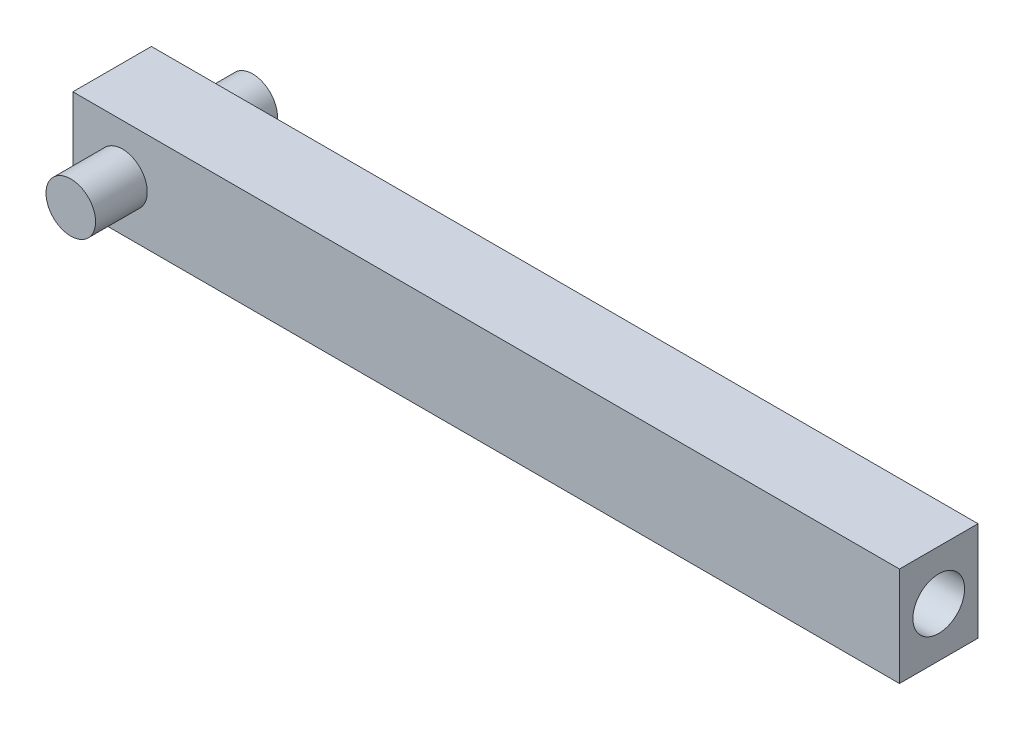
ISO-10303-21;
HEADER;
FILE_DESCRIPTION(('STEP AP214'),'2;1');
FILE_NAME('part.step','',(''),(''),'','','');
FILE_SCHEMA(('AUTOMOTIVE_DESIGN { 1 0 10303 214 1 1 1 1 }'));
ENDSEC;
DATA;
#1=APPLICATION_CONTEXT('core data for automotive mechanical design processes');
#2=APPLICATION_PROTOCOL_DEFINITION('international standard','automotive_design',2000,#1);
#3=PRODUCT_CONTEXT('',#1,'mechanical');
#4=PRODUCT('Part','Part','',(#3));
#5=PRODUCT_RELATED_PRODUCT_CATEGORY('part','',(#4));
#6=PRODUCT_DEFINITION_FORMATION('','',#4);
#7=PRODUCT_DEFINITION_CONTEXT('part definition',#1,'design');
#8=PRODUCT_DEFINITION('design','',#6,#7);
#9=PRODUCT_DEFINITION_SHAPE('','',#8);
#10=(LENGTH_UNIT() NAMED_UNIT(*) SI_UNIT(.MILLI.,.METRE.));
#11=(NAMED_UNIT(*) PLANE_ANGLE_UNIT() SI_UNIT($,.RADIAN.));
#12=(NAMED_UNIT(*) SI_UNIT($,.STERADIAN.) SOLID_ANGLE_UNIT());
#13=UNCERTAINTY_MEASURE_WITH_UNIT(LENGTH_MEASURE(1.E-05),#10,'distance_accuracy_value','');
#14=(GEOMETRIC_REPRESENTATION_CONTEXT(3) GLOBAL_UNCERTAINTY_ASSIGNED_CONTEXT((#13)) GLOBAL_UNIT_ASSIGNED_CONTEXT((#10,
#11,#12)) REPRESENTATION_CONTEXT('',''));
#15=CARTESIAN_POINT('',(0.,0.,0.));
#16=DIRECTION('',(0.,0.,1.));
#17=DIRECTION('',(1.,0.,0.));
#18=AXIS2_PLACEMENT_3D('',#15,#16,#17);
#19=CARTESIAN_POINT('',(200.,48.,-19.));
#20=DIRECTION('',(-1.,0.,0.));
#21=DIRECTION('',(0.,0.,1.));
#22=AXIS2_PLACEMENT_3D('',#19,#20,#21);
#23=PLANE('',#22);
#24=CARTESIAN_POINT('',(200.,24.,0.));
#25=DIRECTION('',(1.,0.,0.));
#26=DIRECTION('',(0.,0.,-1.));
#27=AXIS2_PLACEMENT_3D('',#24,#25,#26);
#28=CIRCLE('',#27,12.5);
#29=CARTESIAN_POINT('',(200.,24.,-12.5));
#30=VERTEX_POINT('',#29);
#31=EDGE_CURVE('E148',#30,#30,#28,.T.);
#32=ORIENTED_EDGE('',*,*,#31,.F.);
#33=EDGE_LOOP('',(#32));
#34=FACE_BOUND('',#33,.T.);
#35=DIRECTION('',(0.,0.,-1.));
#36=VECTOR('',#35,1.);
#37=CARTESIAN_POINT('',(200.,0.,-19.));
#38=LINE('',#37,#36);
#39=CARTESIAN_POINT('',(200.,0.,19.));
#40=VERTEX_POINT('',#39);
#41=CARTESIAN_POINT('',(200.,0.,-19.));
#42=VERTEX_POINT('',#41);
#43=EDGE_CURVE('E114',#40,#42,#38,.T.);
#44=ORIENTED_EDGE('',*,*,#43,.T.);
#45=DIRECTION('',(0.,-1.,0.));
#46=VECTOR('',#45,1.);
#47=CARTESIAN_POINT('',(200.,48.,-19.));
#48=LINE('',#47,#46);
#49=CARTESIAN_POINT('',(200.,48.,-19.));
#50=VERTEX_POINT('',#49);
#51=EDGE_CURVE('E105',#50,#42,#48,.T.);
#52=ORIENTED_EDGE('',*,*,#51,.F.);
#53=DIRECTION('',(0.,0.,-1.));
#54=VECTOR('',#53,1.);
#55=CARTESIAN_POINT('',(200.,48.,-19.));
#56=LINE('',#55,#54);
#57=CARTESIAN_POINT('',(200.,48.,19.));
#58=VERTEX_POINT('',#57);
#59=EDGE_CURVE('E99',#58,#50,#56,.T.);
#60=ORIENTED_EDGE('',*,*,#59,.F.);
#61=DIRECTION('',(0.,-1.,0.));
#62=VECTOR('',#61,1.);
#63=CARTESIAN_POINT('',(200.,48.,19.));
#64=LINE('',#63,#62);
#65=EDGE_CURVE('E110',#58,#40,#64,.T.);
#66=ORIENTED_EDGE('',*,*,#65,.T.);
#67=EDGE_LOOP('',(#44,#52,#60,#66));
#68=FACE_BOUND('',#67,.T.);
#69=ADVANCED_FACE('F47',(#34,#68),#23,.F.);
#70=CARTESIAN_POINT('',(-200.,48.,-19.));
#71=DIRECTION('',(0.,0.,1.));
#72=DIRECTION('',(1.,0.,0.));
#73=AXIS2_PLACEMENT_3D('',#70,#71,#72);
#74=PLANE('',#73);
#75=CARTESIAN_POINT('',(-176.,24.,-19.));
#76=DIRECTION('',(0.,0.,1.));
#77=DIRECTION('',(1.,0.,0.));
#78=AXIS2_PLACEMENT_3D('',#75,#76,#77);
#79=CIRCLE('',#78,12.);
#80=CARTESIAN_POINT('',(-164.,24.,-19.));
#81=VERTEX_POINT('',#80);
#82=EDGE_CURVE('E11',#81,#81,#79,.F.);
#83=ORIENTED_EDGE('',*,*,#82,.F.);
#84=EDGE_LOOP('',(#83));
#85=FACE_BOUND('',#84,.T.);
#86=DIRECTION('',(-1.,0.,0.));
#87=VECTOR('',#86,1.);
#88=CARTESIAN_POINT('',(-200.,0.,-19.));
#89=LINE('',#88,#87);
#90=CARTESIAN_POINT('',(-200.,0.,-19.));
#91=VERTEX_POINT('',#90);
#92=EDGE_CURVE('E104',#42,#91,#89,.T.);
#93=ORIENTED_EDGE('',*,*,#92,.T.);
#94=DIRECTION('',(0.,-1.,0.));
#95=VECTOR('',#94,1.);
#96=CARTESIAN_POINT('',(-200.,48.,-19.));
#97=LINE('',#96,#95);
#98=CARTESIAN_POINT('',(-200.,48.,-19.));
#99=VERTEX_POINT('',#98);
#100=EDGE_CURVE('E102',#99,#91,#97,.T.);
#101=ORIENTED_EDGE('',*,*,#100,.F.);
#102=DIRECTION('',(-1.,0.,0.));
#103=VECTOR('',#102,1.);
#104=CARTESIAN_POINT('',(-200.,48.,-19.));
#105=LINE('',#104,#103);
#106=EDGE_CURVE('E94',#50,#99,#105,.T.);
#107=ORIENTED_EDGE('',*,*,#106,.F.);
#108=ORIENTED_EDGE('',*,*,#51,.T.);
#109=EDGE_LOOP('',(#93,#101,#107,#108));
#110=FACE_BOUND('',#109,.T.);
#111=ADVANCED_FACE('F103',(#85,#110),#74,.F.);
#112=CARTESIAN_POINT('',(-200.,48.,-19.));
#113=DIRECTION('',(1.,0.,0.));
#114=DIRECTION('',(0.,0.,-1.));
#115=AXIS2_PLACEMENT_3D('',#112,#113,#114);
#116=PLANE('',#115);
#117=DIRECTION('',(0.,0.,1.));
#118=VECTOR('',#117,1.);
#119=CARTESIAN_POINT('',(-200.,0.,-19.));
#120=LINE('',#119,#118);
#121=CARTESIAN_POINT('',(-200.,0.,19.));
#122=VERTEX_POINT('',#121);
#123=EDGE_CURVE('E80',#91,#122,#120,.T.);
#124=ORIENTED_EDGE('',*,*,#123,.T.);
#125=DIRECTION('',(0.,-1.,0.));
#126=VECTOR('',#125,1.);
#127=CARTESIAN_POINT('',(-200.,48.,19.));
#128=LINE('',#127,#126);
#129=CARTESIAN_POINT('',(-200.,48.,19.));
#130=VERTEX_POINT('',#129);
#131=EDGE_CURVE('E106',#130,#122,#128,.T.);
#132=ORIENTED_EDGE('',*,*,#131,.F.);
#133=DIRECTION('',(0.,0.,1.));
#134=VECTOR('',#133,1.);
#135=CARTESIAN_POINT('',(-200.,48.,-19.));
#136=LINE('',#135,#134);
#137=EDGE_CURVE('E97',#99,#130,#136,.T.);
#138=ORIENTED_EDGE('',*,*,#137,.F.);
#139=ORIENTED_EDGE('',*,*,#100,.T.);
#140=EDGE_LOOP('',(#124,#132,#138,#139));
#141=FACE_BOUND('',#140,.T.);
#142=ADVANCED_FACE('F108',(#141),#116,.F.);
#143=CARTESIAN_POINT('',(-200.,48.,19.));
#144=DIRECTION('',(0.,0.,-1.));
#145=DIRECTION('',(-1.,0.,0.));
#146=AXIS2_PLACEMENT_3D('',#143,#144,#145);
#147=PLANE('',#146);
#148=CARTESIAN_POINT('',(-176.,24.,19.));
#149=DIRECTION('',(0.,0.,-1.));
#150=DIRECTION('',(-1.,0.,0.));
#151=AXIS2_PLACEMENT_3D('',#148,#149,#150);
#152=CIRCLE('',#151,12.);
#153=CARTESIAN_POINT('',(-188.,24.,19.));
#154=VERTEX_POINT('',#153);
#155=EDGE_CURVE('E55',#154,#154,#152,.F.);
#156=ORIENTED_EDGE('',*,*,#155,.F.);
#157=EDGE_LOOP('',(#156));
#158=FACE_BOUND('',#157,.T.);
#159=DIRECTION('',(1.,0.,0.));
#160=VECTOR('',#159,1.);
#161=CARTESIAN_POINT('',(-200.,0.,19.));
#162=LINE('',#161,#160);
#163=EDGE_CURVE('E86',#122,#40,#162,.T.);
#164=ORIENTED_EDGE('',*,*,#163,.T.);
#165=ORIENTED_EDGE('',*,*,#65,.F.);
#166=DIRECTION('',(1.,0.,0.));
#167=VECTOR('',#166,1.);
#168=CARTESIAN_POINT('',(-200.,48.,19.));
#169=LINE('',#168,#167);
#170=EDGE_CURVE('E63',#130,#58,#169,.T.);
#171=ORIENTED_EDGE('',*,*,#170,.F.);
#172=ORIENTED_EDGE('',*,*,#131,.T.);
#173=EDGE_LOOP('',(#164,#165,#171,#172));
#174=FACE_BOUND('',#173,.T.);
#175=ADVANCED_FACE('F128',(#158,#174),#147,.F.);
#176=CARTESIAN_POINT('',(0.,48.,0.));
#177=DIRECTION('',(0.,1.,0.));
#178=DIRECTION('',(0.,0.,1.));
#179=AXIS2_PLACEMENT_3D('',#176,#177,#178);
#180=PLANE('',#179);
#181=ORIENTED_EDGE('',*,*,#59,.T.);
#182=ORIENTED_EDGE('',*,*,#106,.T.);
#183=ORIENTED_EDGE('',*,*,#137,.T.);
#184=ORIENTED_EDGE('',*,*,#170,.T.);
#185=EDGE_LOOP('',(#181,#182,#183,#184));
#186=FACE_BOUND('',#185,.T.);
#187=ADVANCED_FACE('F95',(#186),#180,.T.);
#188=CARTESIAN_POINT('',(0.,0.,0.));
#189=DIRECTION('',(0.,1.,0.));
#190=DIRECTION('',(0.,0.,1.));
#191=AXIS2_PLACEMENT_3D('',#188,#189,#190);
#192=PLANE('',#191);
#193=ORIENTED_EDGE('',*,*,#43,.F.);
#194=ORIENTED_EDGE('',*,*,#163,.F.);
#195=ORIENTED_EDGE('',*,*,#123,.F.);
#196=ORIENTED_EDGE('',*,*,#92,.F.);
#197=EDGE_LOOP('',(#193,#194,#195,#196));
#198=FACE_BOUND('',#197,.T.);
#199=ADVANCED_FACE('F135',(#198),#192,.F.);
#200=CARTESIAN_POINT('',(-176.,24.,44.));
#201=DIRECTION('',(0.,0.,-1.));
#202=DIRECTION('',(-1.,0.,0.));
#203=AXIS2_PLACEMENT_3D('',#200,#201,#202);
#204=CYLINDRICAL_SURFACE('',#203,12.);
#205=CARTESIAN_POINT('',(-176.,24.,44.));
#206=DIRECTION('',(0.,0.,1.));
#207=DIRECTION('',(1.,0.,0.));
#208=AXIS2_PLACEMENT_3D('',#205,#206,#207);
#209=CIRCLE('',#208,12.);
#210=CARTESIAN_POINT('',(-164.,24.,44.));
#211=VERTEX_POINT('',#210);
#212=EDGE_CURVE('E117',#211,#211,#209,.T.);
#213=ORIENTED_EDGE('',*,*,#212,.F.);
#214=EDGE_LOOP('',(#213));
#215=FACE_BOUND('',#214,.T.);
#216=ORIENTED_EDGE('',*,*,#155,.T.);
#217=EDGE_LOOP('',(#216));
#218=FACE_BOUND('',#217,.T.);
#219=ADVANCED_FACE('F126',(#215,#218),#204,.T.);
#220=CARTESIAN_POINT('',(-176.,24.,44.));
#221=DIRECTION('',(0.,0.,1.));
#222=DIRECTION('',(1.,0.,0.));
#223=AXIS2_PLACEMENT_3D('',#220,#221,#222);
#224=PLANE('',#223);
#225=ORIENTED_EDGE('',*,*,#212,.T.);
#226=EDGE_LOOP('',(#225));
#227=FACE_BOUND('',#226,.T.);
#228=ADVANCED_FACE('F155',(#227),#224,.T.);
#229=CARTESIAN_POINT('',(-176.,24.,-44.));
#230=DIRECTION('',(0.,0.,1.));
#231=DIRECTION('',(1.,0.,0.));
#232=AXIS2_PLACEMENT_3D('',#229,#230,#231);
#233=CYLINDRICAL_SURFACE('',#232,12.);
#234=CARTESIAN_POINT('',(-176.,24.,-44.));
#235=DIRECTION('',(0.,0.,-1.));
#236=DIRECTION('',(-1.,0.,0.));
#237=AXIS2_PLACEMENT_3D('',#234,#235,#236);
#238=CIRCLE('',#237,12.);
#239=CARTESIAN_POINT('',(-188.,24.,-44.));
#240=VERTEX_POINT('',#239);
#241=EDGE_CURVE('E182',#240,#240,#238,.T.);
#242=ORIENTED_EDGE('',*,*,#241,.F.);
#243=EDGE_LOOP('',(#242));
#244=FACE_BOUND('',#243,.T.);
#245=ORIENTED_EDGE('',*,*,#82,.T.);
#246=EDGE_LOOP('',(#245));
#247=FACE_BOUND('',#246,.T.);
#248=ADVANCED_FACE('F161',(#244,#247),#233,.T.);
#249=CARTESIAN_POINT('',(-176.,24.,-44.));
#250=DIRECTION('',(0.,0.,-1.));
#251=DIRECTION('',(-1.,0.,0.));
#252=AXIS2_PLACEMENT_3D('',#249,#250,#251);
#253=PLANE('',#252);
#254=ORIENTED_EDGE('',*,*,#241,.T.);
#255=EDGE_LOOP('',(#254));
#256=FACE_BOUND('',#255,.T.);
#257=ADVANCED_FACE('F165',(#256),#253,.T.);
#258=CARTESIAN_POINT('',(150.,24.,0.));
#259=DIRECTION('',(1.,0.,0.));
#260=DIRECTION('',(0.,0.,-1.));
#261=AXIS2_PLACEMENT_3D('',#258,#259,#260);
#262=CYLINDRICAL_SURFACE('',#261,12.5);
#263=CARTESIAN_POINT('',(150.,24.,0.));
#264=DIRECTION('',(1.,0.,0.));
#265=DIRECTION('',(0.,0.,-1.));
#266=AXIS2_PLACEMENT_3D('',#263,#264,#265);
#267=CIRCLE('',#266,12.5);
#268=CARTESIAN_POINT('',(150.,24.,-12.5));
#269=VERTEX_POINT('',#268);
#270=EDGE_CURVE('E181',#269,#269,#267,.T.);
#271=ORIENTED_EDGE('',*,*,#270,.F.);
#272=EDGE_LOOP('',(#271));
#273=FACE_BOUND('',#272,.T.);
#274=ORIENTED_EDGE('',*,*,#31,.T.);
#275=EDGE_LOOP('',(#274));
#276=FACE_BOUND('',#275,.T.);
#277=ADVANCED_FACE('F169',(#273,#276),#262,.F.);
#278=CARTESIAN_POINT('',(150.,24.,0.));
#279=DIRECTION('',(1.,0.,0.));
#280=DIRECTION('',(0.,0.,-1.));
#281=AXIS2_PLACEMENT_3D('',#278,#279,#280);
#282=PLANE('',#281);
#283=ORIENTED_EDGE('',*,*,#270,.T.);
#284=EDGE_LOOP('',(#283));
#285=FACE_BOUND('',#284,.T.);
#286=ADVANCED_FACE('F173',(#285),#282,.T.);
#287=CLOSED_SHELL('',(#69,#111,#142,#175,#187,#199,#219,#228,#248,#257,#277,#286));
#288=MANIFOLD_SOLID_BREP('B2',#287);
#289=ADVANCED_BREP_SHAPE_REPRESENTATION('',(#18,#288),#14);
#290=SHAPE_DEFINITION_REPRESENTATION(#9,#289);
ENDSEC;
END-ISO-10303-21;
